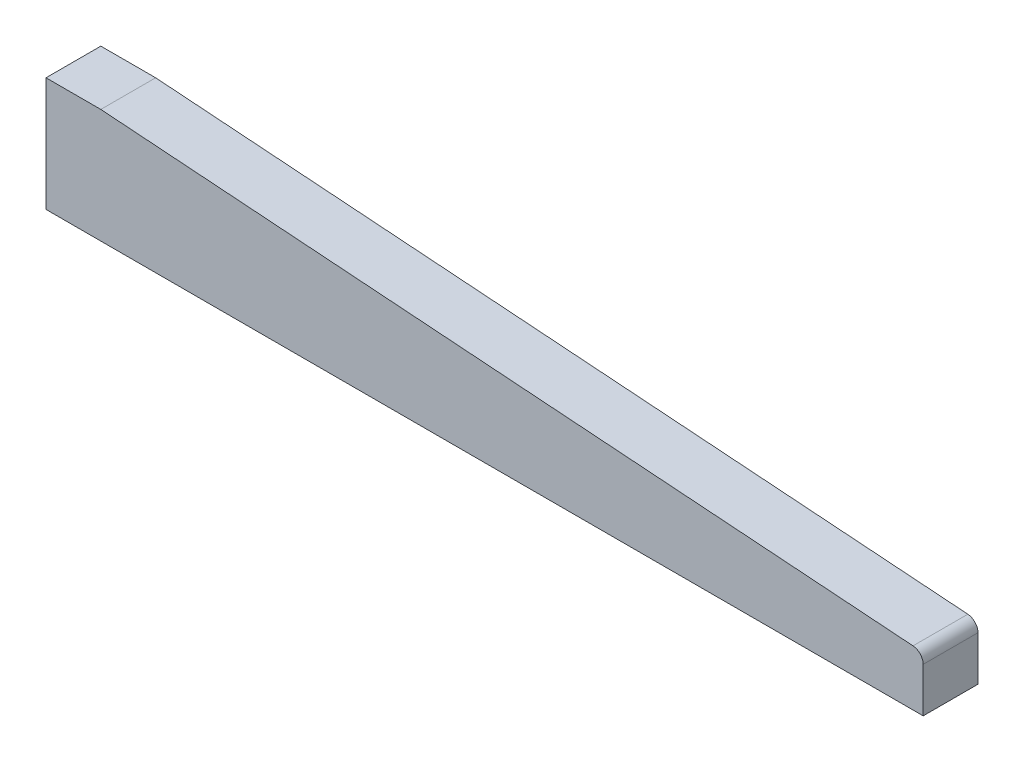
ISO-10303-21;
HEADER;
FILE_DESCRIPTION(('STEP AP214'),'2;1');
FILE_NAME('part.step','',(''),(''),'','','');
FILE_SCHEMA(('AUTOMOTIVE_DESIGN { 1 0 10303 214 1 1 1 1 }'));
ENDSEC;
DATA;
#1=APPLICATION_CONTEXT('core data for automotive mechanical design processes');
#2=APPLICATION_PROTOCOL_DEFINITION('international standard','automotive_design',2000,#1);
#3=PRODUCT_CONTEXT('',#1,'mechanical');
#4=PRODUCT('Part','Part','',(#3));
#5=PRODUCT_RELATED_PRODUCT_CATEGORY('part','',(#4));
#6=PRODUCT_DEFINITION_FORMATION('','',#4);
#7=PRODUCT_DEFINITION_CONTEXT('part definition',#1,'design');
#8=PRODUCT_DEFINITION('design','',#6,#7);
#9=PRODUCT_DEFINITION_SHAPE('','',#8);
#10=(LENGTH_UNIT() NAMED_UNIT(*) SI_UNIT(.MILLI.,.METRE.));
#11=(NAMED_UNIT(*) PLANE_ANGLE_UNIT() SI_UNIT($,.RADIAN.));
#12=(NAMED_UNIT(*) SI_UNIT($,.STERADIAN.) SOLID_ANGLE_UNIT());
#13=UNCERTAINTY_MEASURE_WITH_UNIT(LENGTH_MEASURE(1.E-05),#10,'distance_accuracy_value','');
#14=(GEOMETRIC_REPRESENTATION_CONTEXT(3) GLOBAL_UNCERTAINTY_ASSIGNED_CONTEXT((#13)) GLOBAL_UNIT_ASSIGNED_CONTEXT((#10,
#11,#12)) REPRESENTATION_CONTEXT('',''));
#15=CARTESIAN_POINT('',(0.,0.,0.));
#16=DIRECTION('',(0.,0.,1.));
#17=DIRECTION('',(1.,0.,0.));
#18=AXIS2_PLACEMENT_3D('',#15,#16,#17);
#19=CARTESIAN_POINT('',(50.8,0.,1.5875));
#20=DIRECTION('',(0.,1.,0.));
#21=DIRECTION('',(-1.,0.,0.));
#22=AXIS2_PLACEMENT_3D('',#19,#20,#21);
#23=PLANE('',#22);
#24=DIRECTION('',(1.,0.,0.));
#25=VECTOR('',#24,1.);
#26=CARTESIAN_POINT('',(50.8,0.,-1.5875));
#27=LINE('',#26,#25);
#28=CARTESIAN_POINT('',(0.,0.,-1.5875));
#29=VERTEX_POINT('',#28);
#30=CARTESIAN_POINT('',(50.8,0.,-1.5875));
#31=VERTEX_POINT('',#30);
#32=EDGE_CURVE('E109',#29,#31,#27,.T.);
#33=ORIENTED_EDGE('',*,*,#32,.T.);
#34=DIRECTION('',(0.,0.,-1.));
#35=VECTOR('',#34,1.);
#36=CARTESIAN_POINT('',(50.8,0.,1.5875));
#37=LINE('',#36,#35);
#38=CARTESIAN_POINT('',(50.8,0.,1.5875));
#39=VERTEX_POINT('',#38);
#40=EDGE_CURVE('E91',#39,#31,#37,.T.);
#41=ORIENTED_EDGE('',*,*,#40,.F.);
#42=DIRECTION('',(1.,0.,0.));
#43=VECTOR('',#42,1.);
#44=CARTESIAN_POINT('',(50.8,0.,1.5875));
#45=LINE('',#44,#43);
#46=CARTESIAN_POINT('',(0.,0.,1.5875));
#47=VERTEX_POINT('',#46);
#48=EDGE_CURVE('E97',#47,#39,#45,.T.);
#49=ORIENTED_EDGE('',*,*,#48,.F.);
#50=DIRECTION('',(0.,0.,-1.));
#51=VECTOR('',#50,1.);
#52=CARTESIAN_POINT('',(0.,0.,1.5875));
#53=LINE('',#52,#51);
#54=EDGE_CURVE('E122',#47,#29,#53,.T.);
#55=ORIENTED_EDGE('',*,*,#54,.T.);
#56=EDGE_LOOP('',(#33,#41,#49,#55));
#57=FACE_BOUND('',#56,.T.);
#58=ADVANCED_FACE('F37',(#57),#23,.F.);
#59=CARTESIAN_POINT('',(50.8,3.175,1.5875));
#60=DIRECTION('',(-1.,0.,0.));
#61=DIRECTION('',(0.,0.,1.));
#62=AXIS2_PLACEMENT_3D('',#59,#60,#61);
#63=PLANE('',#62);
#64=DIRECTION('',(0.,1.,0.));
#65=VECTOR('',#64,1.);
#66=CARTESIAN_POINT('',(50.8,3.175,-1.5875));
#67=LINE('',#66,#65);
#68=CARTESIAN_POINT('',(50.8,2.58407620760114,-1.5875));
#69=VERTEX_POINT('',#68);
#70=EDGE_CURVE('E129',#31,#69,#67,.T.);
#71=ORIENTED_EDGE('',*,*,#70,.T.);
#72=DIRECTION('',(0.,0.,-1.));
#73=VECTOR('',#72,1.);
#74=CARTESIAN_POINT('',(50.8,2.58407620760114,1.5875));
#75=LINE('',#74,#73);
#76=CARTESIAN_POINT('',(50.8,2.58407620760114,1.5875));
#77=VERTEX_POINT('',#76);
#78=EDGE_CURVE('E46',#69,#77,#75,.F.);
#79=ORIENTED_EDGE('',*,*,#78,.T.);
#80=DIRECTION('',(0.,1.,0.));
#81=VECTOR('',#80,1.);
#82=CARTESIAN_POINT('',(50.8,3.175,1.5875));
#83=LINE('',#82,#81);
#84=EDGE_CURVE('E87',#39,#77,#83,.T.);
#85=ORIENTED_EDGE('',*,*,#84,.F.);
#86=ORIENTED_EDGE('',*,*,#40,.T.);
#87=EDGE_LOOP('',(#71,#79,#85,#86));
#88=FACE_BOUND('',#87,.T.);
#89=ADVANCED_FACE('F89',(#88),#63,.F.);
#90=CARTESIAN_POINT('',(3.175,6.60399999999999,1.5875));
#91=DIRECTION('',(-0.0718140984736977,-0.997418034356914,0.));
#92=DIRECTION('',(0.997418034356914,-0.0718140984736977,0.));
#93=AXIS2_PLACEMENT_3D('',#90,#91,#92);
#94=PLANE('',#93);
#95=DIRECTION('',(-0.997418034356914,0.0718140984736977,0.));
#96=VECTOR('',#95,1.);
#97=CARTESIAN_POINT('',(3.175,6.60399999999999,1.5875));
#98=LINE('',#97,#96);
#99=CARTESIAN_POINT('',(50.2106019525308,3.21743665941778,1.5875));
#100=VERTEX_POINT('',#99);
#101=CARTESIAN_POINT('',(3.175,6.60399999999999,1.5875));
#102=VERTEX_POINT('',#101);
#103=EDGE_CURVE('E96',#100,#102,#98,.T.);
#104=ORIENTED_EDGE('',*,*,#103,.F.);
#105=DIRECTION('',(0.,0.,-1.));
#106=VECTOR('',#105,1.);
#107=CARTESIAN_POINT('',(50.2106019525308,3.21743665941778,1.5875));
#108=LINE('',#107,#106);
#109=CARTESIAN_POINT('',(50.2106019525308,3.21743665941778,-1.5875));
#110=VERTEX_POINT('',#109);
#111=EDGE_CURVE('E110',#100,#110,#108,.T.);
#112=ORIENTED_EDGE('',*,*,#111,.T.);
#113=DIRECTION('',(-0.997418034356914,0.0718140984736977,0.));
#114=VECTOR('',#113,1.);
#115=CARTESIAN_POINT('',(3.175,6.60399999999999,-1.5875));
#116=LINE('',#115,#114);
#117=CARTESIAN_POINT('',(3.175,6.60399999999999,-1.5875));
#118=VERTEX_POINT('',#117);
#119=EDGE_CURVE('E127',#110,#118,#116,.T.);
#120=ORIENTED_EDGE('',*,*,#119,.T.);
#121=DIRECTION('',(0.,0.,-1.));
#122=VECTOR('',#121,1.);
#123=CARTESIAN_POINT('',(3.175,6.60399999999999,1.5875));
#124=LINE('',#123,#122);
#125=EDGE_CURVE('E111',#102,#118,#124,.T.);
#126=ORIENTED_EDGE('',*,*,#125,.F.);
#127=EDGE_LOOP('',(#104,#112,#120,#126));
#128=FACE_BOUND('',#127,.T.);
#129=ADVANCED_FACE('F160',(#128),#94,.F.);
#130=CARTESIAN_POINT('',(0.,6.60399999999999,1.5875));
#131=DIRECTION('',(0.,-1.,0.));
#132=DIRECTION('',(0.,0.,-1.));
#133=AXIS2_PLACEMENT_3D('',#130,#131,#132);
#134=PLANE('',#133);
#135=DIRECTION('',(-1.,0.,0.));
#136=VECTOR('',#135,1.);
#137=CARTESIAN_POINT('',(0.,6.60399999999999,-1.5875));
#138=LINE('',#137,#136);
#139=CARTESIAN_POINT('',(0.,6.60399999999999,-1.5875));
#140=VERTEX_POINT('',#139);
#141=EDGE_CURVE('E125',#118,#140,#138,.T.);
#142=ORIENTED_EDGE('',*,*,#141,.T.);
#143=DIRECTION('',(0.,0.,-1.));
#144=VECTOR('',#143,1.);
#145=CARTESIAN_POINT('',(0.,6.60399999999999,1.5875));
#146=LINE('',#145,#144);
#147=CARTESIAN_POINT('',(0.,6.60399999999999,1.5875));
#148=VERTEX_POINT('',#147);
#149=EDGE_CURVE('E116',#148,#140,#146,.T.);
#150=ORIENTED_EDGE('',*,*,#149,.F.);
#151=DIRECTION('',(-1.,0.,0.));
#152=VECTOR('',#151,1.);
#153=CARTESIAN_POINT('',(0.,6.60399999999999,1.5875));
#154=LINE('',#153,#152);
#155=EDGE_CURVE('E135',#102,#148,#154,.T.);
#156=ORIENTED_EDGE('',*,*,#155,.F.);
#157=ORIENTED_EDGE('',*,*,#125,.T.);
#158=EDGE_LOOP('',(#142,#150,#156,#157));
#159=FACE_BOUND('',#158,.T.);
#160=ADVANCED_FACE('F151',(#159),#134,.F.);
#161=CARTESIAN_POINT('',(0.,0.,1.5875));
#162=DIRECTION('',(1.,0.,0.));
#163=DIRECTION('',(0.,0.,-1.));
#164=AXIS2_PLACEMENT_3D('',#161,#162,#163);
#165=PLANE('',#164);
#166=DIRECTION('',(0.,-1.,0.));
#167=VECTOR('',#166,1.);
#168=CARTESIAN_POINT('',(0.,0.,-1.5875));
#169=LINE('',#168,#167);
#170=EDGE_CURVE('E107',#140,#29,#169,.T.);
#171=ORIENTED_EDGE('',*,*,#170,.T.);
#172=ORIENTED_EDGE('',*,*,#54,.F.);
#173=DIRECTION('',(0.,-1.,0.));
#174=VECTOR('',#173,1.);
#175=CARTESIAN_POINT('',(0.,0.,1.5875));
#176=LINE('',#175,#174);
#177=EDGE_CURVE('E102',#148,#47,#176,.T.);
#178=ORIENTED_EDGE('',*,*,#177,.F.);
#179=ORIENTED_EDGE('',*,*,#149,.T.);
#180=EDGE_LOOP('',(#171,#172,#178,#179));
#181=FACE_BOUND('',#180,.T.);
#182=ADVANCED_FACE('F155',(#181),#165,.F.);
#183=CARTESIAN_POINT('',(0.,0.,1.5875));
#184=DIRECTION('',(0.,0.,-1.));
#185=DIRECTION('',(-1.,0.,0.));
#186=AXIS2_PLACEMENT_3D('',#183,#184,#185);
#187=PLANE('',#186);
#188=ORIENTED_EDGE('',*,*,#84,.T.);
#189=CARTESIAN_POINT('',(50.165,2.58407620760114,1.5875));
#190=DIRECTION('',(0.,0.,-1.));
#191=DIRECTION('',(-1.,0.,0.));
#192=AXIS2_PLACEMENT_3D('',#189,#190,#191);
#193=CIRCLE('',#192,0.635);
#194=EDGE_CURVE('E12',#77,#100,#193,.F.);
#195=ORIENTED_EDGE('',*,*,#194,.T.);
#196=ORIENTED_EDGE('',*,*,#103,.T.);
#197=ORIENTED_EDGE('',*,*,#155,.T.);
#198=ORIENTED_EDGE('',*,*,#177,.T.);
#199=ORIENTED_EDGE('',*,*,#48,.T.);
#200=EDGE_LOOP('',(#188,#195,#196,#197,#198,#199));
#201=FACE_BOUND('',#200,.T.);
#202=ADVANCED_FACE('F100',(#201),#187,.F.);
#203=CARTESIAN_POINT('',(0.,0.,-1.5875));
#204=DIRECTION('',(0.,0.,-1.));
#205=DIRECTION('',(-1.,0.,0.));
#206=AXIS2_PLACEMENT_3D('',#203,#204,#205);
#207=PLANE('',#206);
#208=ORIENTED_EDGE('',*,*,#119,.F.);
#209=CARTESIAN_POINT('',(50.165,2.58407620760114,-1.5875));
#210=DIRECTION('',(0.,0.,-1.));
#211=DIRECTION('',(-1.,0.,0.));
#212=AXIS2_PLACEMENT_3D('',#209,#210,#211);
#213=CIRCLE('',#212,0.635);
#214=EDGE_CURVE('E60',#110,#69,#213,.T.);
#215=ORIENTED_EDGE('',*,*,#214,.T.);
#216=ORIENTED_EDGE('',*,*,#70,.F.);
#217=ORIENTED_EDGE('',*,*,#32,.F.);
#218=ORIENTED_EDGE('',*,*,#170,.F.);
#219=ORIENTED_EDGE('',*,*,#141,.F.);
#220=EDGE_LOOP('',(#208,#215,#216,#217,#218,#219));
#221=FACE_BOUND('',#220,.T.);
#222=ADVANCED_FACE('F156',(#221),#207,.T.);
#223=CARTESIAN_POINT('',(50.165,2.58407620760114,1.5875));
#224=DIRECTION('',(0.,0.,-1.));
#225=DIRECTION('',(-1.,0.,0.));
#226=AXIS2_PLACEMENT_3D('',#223,#224,#225);
#227=CYLINDRICAL_SURFACE('',#226,0.635);
#228=ORIENTED_EDGE('',*,*,#194,.F.);
#229=ORIENTED_EDGE('',*,*,#78,.F.);
#230=ORIENTED_EDGE('',*,*,#214,.F.);
#231=ORIENTED_EDGE('',*,*,#111,.F.);
#232=EDGE_LOOP('',(#228,#229,#230,#231));
#233=FACE_BOUND('',#232,.T.);
#234=ADVANCED_FACE('F39',(#233),#227,.T.);
#235=CLOSED_SHELL('',(#58,#89,#129,#160,#182,#202,#222,#234));
#236=MANIFOLD_SOLID_BREP('B2',#235);
#237=ADVANCED_BREP_SHAPE_REPRESENTATION('',(#18,#236),#14);
#238=SHAPE_DEFINITION_REPRESENTATION(#9,#237);
ENDSEC;
END-ISO-10303-21;
